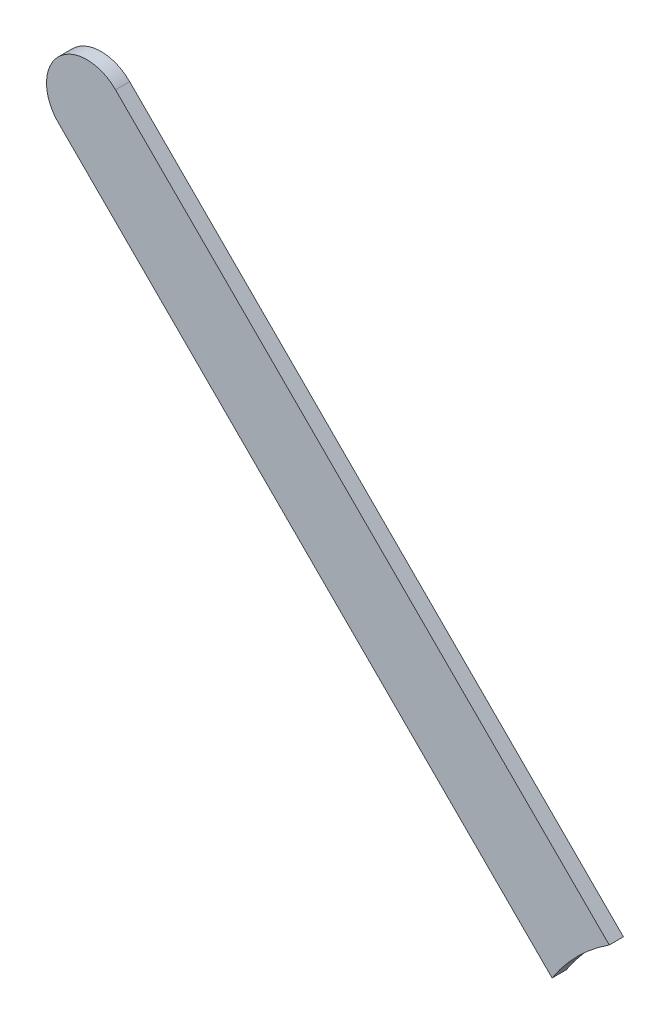
ISO-10303-21;
HEADER;
FILE_DESCRIPTION(('STEP AP214'),'2;1');
FILE_NAME('part.step','',(''),(''),'','','');
FILE_SCHEMA(('AUTOMOTIVE_DESIGN { 1 0 10303 214 1 1 1 1 }'));
ENDSEC;
DATA;
#1=APPLICATION_CONTEXT('core data for automotive mechanical design processes');
#2=APPLICATION_PROTOCOL_DEFINITION('international standard','automotive_design',2000,#1);
#3=PRODUCT_CONTEXT('',#1,'mechanical');
#4=PRODUCT('Part','Part','',(#3));
#5=PRODUCT_RELATED_PRODUCT_CATEGORY('part','',(#4));
#6=PRODUCT_DEFINITION_FORMATION('','',#4);
#7=PRODUCT_DEFINITION_CONTEXT('part definition',#1,'design');
#8=PRODUCT_DEFINITION('design','',#6,#7);
#9=PRODUCT_DEFINITION_SHAPE('','',#8);
#10=(LENGTH_UNIT() NAMED_UNIT(*) SI_UNIT(.MILLI.,.METRE.));
#11=(NAMED_UNIT(*) PLANE_ANGLE_UNIT() SI_UNIT($,.RADIAN.));
#12=(NAMED_UNIT(*) SI_UNIT($,.STERADIAN.) SOLID_ANGLE_UNIT());
#13=UNCERTAINTY_MEASURE_WITH_UNIT(LENGTH_MEASURE(1.E-05),#10,'distance_accuracy_value','');
#14=(GEOMETRIC_REPRESENTATION_CONTEXT(3) GLOBAL_UNCERTAINTY_ASSIGNED_CONTEXT((#13)) GLOBAL_UNIT_ASSIGNED_CONTEXT((#10,
#11,#12)) REPRESENTATION_CONTEXT('',''));
#15=CARTESIAN_POINT('',(0.,0.,0.));
#16=DIRECTION('',(0.,0.,1.));
#17=DIRECTION('',(1.,0.,0.));
#18=AXIS2_PLACEMENT_3D('',#15,#16,#17);
#19=CARTESIAN_POINT('',(97.53071,-141.929289,1.6));
#20=DIRECTION('',(-0.707106781186548,-0.707106781186548,0.));
#21=DIRECTION('',(-0.707106781186548,0.707106781186548,0.));
#22=AXIS2_PLACEMENT_3D('',#19,#20,#21);
#23=PLANE('',#22);
#24=DIRECTION('',(0.,0.,1.));
#25=VECTOR('',#24,1.);
#26=CARTESIAN_POINT('',(95.98071,-140.379289,1.6));
#27=LINE('',#26,#25);
#28=CARTESIAN_POINT('',(95.98071,-140.379289,1.6));
#29=VERTEX_POINT('',#28);
#30=CARTESIAN_POINT('',(95.98071,-140.379289,1.635));
#31=VERTEX_POINT('',#30);
#32=EDGE_CURVE('E11',#29,#31,#27,.T.);
#33=ORIENTED_EDGE('',*,*,#32,.T.);
#34=DIRECTION('',(-0.707106781186548,0.707106781186548,0.));
#35=VECTOR('',#34,1.);
#36=CARTESIAN_POINT('',(97.53071,-141.929289,1.635));
#37=LINE('',#36,#35);
#38=CARTESIAN_POINT('',(97.20236232323,-141.6009413232,1.635));
#39=VERTEX_POINT('',#38);
#40=EDGE_CURVE('E20',#39,#31,#37,.T.);
#41=ORIENTED_EDGE('',*,*,#40,.F.);
#42=DIRECTION('',(0.,0.,-1.));
#43=VECTOR('',#42,1.);
#44=CARTESIAN_POINT('',(97.202362323228,-141.6009413232,-0.045));
#45=LINE('',#44,#43);
#46=CARTESIAN_POINT('',(97.20236232323,-141.6009413232,1.6));
#47=VERTEX_POINT('',#46);
#48=EDGE_CURVE('E58',#39,#47,#45,.T.);
#49=ORIENTED_EDGE('',*,*,#48,.T.);
#50=DIRECTION('',(-0.707106781186548,0.707106781186548,0.));
#51=VECTOR('',#50,1.);
#52=CARTESIAN_POINT('',(97.53071,-141.929289,1.6));
#53=LINE('',#52,#51);
#54=EDGE_CURVE('E61',#47,#29,#53,.T.);
#55=ORIENTED_EDGE('',*,*,#54,.T.);
#56=EDGE_LOOP('',(#33,#41,#49,#55));
#57=FACE_BOUND('',#56,.T.);
#58=ADVANCED_FACE('F17',(#57),#23,.F.);
#59=CARTESIAN_POINT('',(95.9099995,-140.4499995,1.6));
#60=DIRECTION('',(0.,0.,-1.));
#61=DIRECTION('',(0.707106781187048,0.707106781186048,0.));
#62=AXIS2_PLACEMENT_3D('',#59,#60,#61);
#63=CYLINDRICAL_SURFACE('',#62,0.09999974810219);
#64=CARTESIAN_POINT('',(95.9099995,-140.4499995,1.6));
#65=DIRECTION('',(0.,0.,1.));
#66=DIRECTION('',(0.707106781187047,0.707106781186048,0.));
#67=AXIS2_PLACEMENT_3D('',#64,#65,#66);
#68=CIRCLE('',#67,0.09999974810219);
#69=CARTESIAN_POINT('',(95.839289,-140.52071,1.6));
#70=VERTEX_POINT('',#69);
#71=EDGE_CURVE('E79',#29,#70,#68,.T.);
#72=ORIENTED_EDGE('',*,*,#71,.T.);
#73=DIRECTION('',(0.,0.,1.));
#74=VECTOR('',#73,1.);
#75=CARTESIAN_POINT('',(95.839289,-140.52071,1.6));
#76=LINE('',#75,#74);
#77=CARTESIAN_POINT('',(95.839289,-140.52071,1.635));
#78=VERTEX_POINT('',#77);
#79=EDGE_CURVE('E90',#70,#78,#76,.T.);
#80=ORIENTED_EDGE('',*,*,#79,.T.);
#81=CARTESIAN_POINT('',(95.9099995,-140.4499995,1.635));
#82=DIRECTION('',(0.,0.,1.));
#83=DIRECTION('',(0.707106781187047,0.707106781186048,0.));
#84=AXIS2_PLACEMENT_3D('',#81,#82,#83);
#85=CIRCLE('',#84,0.09999974810219);
#86=EDGE_CURVE('E66',#31,#78,#85,.T.);
#87=ORIENTED_EDGE('',*,*,#86,.F.);
#88=ORIENTED_EDGE('',*,*,#32,.F.);
#89=EDGE_LOOP('',(#72,#80,#87,#88));
#90=FACE_BOUND('',#89,.T.);
#91=ADVANCED_FACE('F123',(#90),#63,.T.);
#92=CARTESIAN_POINT('',(95.839289,-140.52071,1.635));
#93=DIRECTION('',(0.,0.,1.));
#94=DIRECTION('',(1.,0.,0.));
#95=AXIS2_PLACEMENT_3D('',#92,#93,#94);
#96=PLANE('',#95);
#97=ORIENTED_EDGE('',*,*,#86,.T.);
#98=DIRECTION('',(0.707106781186548,-0.707106781186548,0.));
#99=VECTOR('',#98,1.);
#100=CARTESIAN_POINT('',(95.839289,-140.52071,1.635));
#101=LINE('',#100,#99);
#102=CARTESIAN_POINT('',(97.060941323237,-141.7423623232,1.635));
#103=VERTEX_POINT('',#102);
#104=EDGE_CURVE('E95',#78,#103,#101,.T.);
#105=ORIENTED_EDGE('',*,*,#104,.T.);
#106=CARTESIAN_POINT('',(97.46,-142.,1.635));
#107=DIRECTION('',(0.,0.,-1.));
#108=DIRECTION('',(0.,-1.,0.));
#109=AXIS2_PLACEMENT_3D('',#106,#107,#108);
#110=CIRCLE('',#109,0.475);
#111=EDGE_CURVE('E67',#103,#39,#110,.T.);
#112=ORIENTED_EDGE('',*,*,#111,.T.);
#113=ORIENTED_EDGE('',*,*,#40,.T.);
#114=EDGE_LOOP('',(#97,#105,#112,#113));
#115=FACE_BOUND('',#114,.T.);
#116=ADVANCED_FACE('F109',(#115),#96,.T.);
#117=CARTESIAN_POINT('',(97.46,-142.,-0.045));
#118=DIRECTION('',(0.,0.,-1.));
#119=DIRECTION('',(0.,-1.,0.));
#120=AXIS2_PLACEMENT_3D('',#117,#118,#119);
#121=CYLINDRICAL_SURFACE('',#120,0.475);
#122=ORIENTED_EDGE('',*,*,#111,.F.);
#123=DIRECTION('',(0.,0.,-1.));
#124=VECTOR('',#123,1.);
#125=CARTESIAN_POINT('',(97.060941323228,-141.7423623232,-0.045));
#126=LINE('',#125,#124);
#127=CARTESIAN_POINT('',(97.060941323237,-141.7423623232,1.6));
#128=VERTEX_POINT('',#127);
#129=EDGE_CURVE('E74',#103,#128,#126,.T.);
#130=ORIENTED_EDGE('',*,*,#129,.T.);
#131=CARTESIAN_POINT('',(97.46,-142.,1.6));
#132=DIRECTION('',(0.,0.,-1.));
#133=DIRECTION('',(0.,-1.,0.));
#134=AXIS2_PLACEMENT_3D('',#131,#132,#133);
#135=CIRCLE('',#134,0.475);
#136=EDGE_CURVE('E71',#128,#47,#135,.T.);
#137=ORIENTED_EDGE('',*,*,#136,.T.);
#138=ORIENTED_EDGE('',*,*,#48,.F.);
#139=EDGE_LOOP('',(#122,#130,#137,#138));
#140=FACE_BOUND('',#139,.T.);
#141=ADVANCED_FACE('F72',(#140),#121,.F.);
#142=CARTESIAN_POINT('',(95.839289,-140.52071,1.6));
#143=DIRECTION('',(0.,0.,1.));
#144=DIRECTION('',(1.,0.,0.));
#145=AXIS2_PLACEMENT_3D('',#142,#143,#144);
#146=PLANE('',#145);
#147=ORIENTED_EDGE('',*,*,#54,.F.);
#148=ORIENTED_EDGE('',*,*,#136,.F.);
#149=DIRECTION('',(0.707106781186548,-0.707106781186548,0.));
#150=VECTOR('',#149,1.);
#151=CARTESIAN_POINT('',(95.839289,-140.52071,1.6));
#152=LINE('',#151,#150);
#153=EDGE_CURVE('E84',#70,#128,#152,.T.);
#154=ORIENTED_EDGE('',*,*,#153,.F.);
#155=ORIENTED_EDGE('',*,*,#71,.F.);
#156=EDGE_LOOP('',(#147,#148,#154,#155));
#157=FACE_BOUND('',#156,.T.);
#158=ADVANCED_FACE('F82',(#157),#146,.F.);
#159=CARTESIAN_POINT('',(95.839289,-140.52071,1.6));
#160=DIRECTION('',(0.707106781186548,0.707106781186548,0.));
#161=DIRECTION('',(0.,0.,-1.));
#162=AXIS2_PLACEMENT_3D('',#159,#160,#161);
#163=PLANE('',#162);
#164=ORIENTED_EDGE('',*,*,#129,.F.);
#165=ORIENTED_EDGE('',*,*,#104,.F.);
#166=ORIENTED_EDGE('',*,*,#79,.F.);
#167=ORIENTED_EDGE('',*,*,#153,.T.);
#168=EDGE_LOOP('',(#164,#165,#166,#167));
#169=FACE_BOUND('',#168,.T.);
#170=ADVANCED_FACE('F151',(#169),#163,.F.);
#171=CLOSED_SHELL('',(#58,#91,#116,#141,#158,#170));
#172=MANIFOLD_SOLID_BREP('B1',#171);
#173=ADVANCED_BREP_SHAPE_REPRESENTATION('',(#18,#172),#14);
#174=SHAPE_DEFINITION_REPRESENTATION(#9,#173);
ENDSEC;
END-ISO-10303-21;
